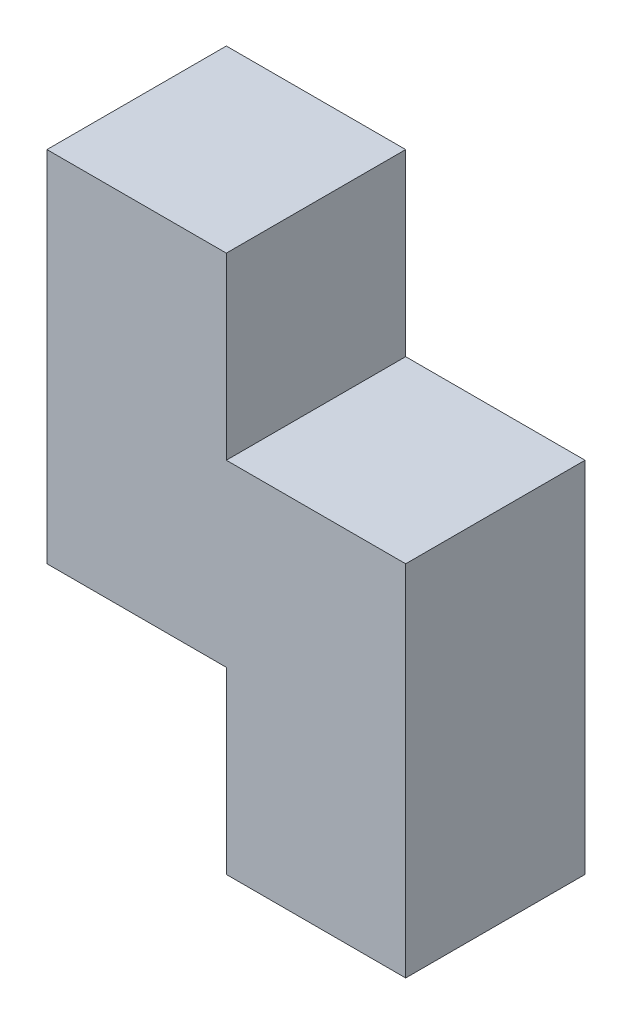
ISO-10303-21;
HEADER;
FILE_DESCRIPTION(('STEP AP214'),'2;1');
FILE_NAME('part.step','',(''),(''),'','','');
FILE_SCHEMA(('AUTOMOTIVE_DESIGN { 1 0 10303 214 1 1 1 1 }'));
ENDSEC;
DATA;
#1=APPLICATION_CONTEXT('core data for automotive mechanical design processes');
#2=APPLICATION_PROTOCOL_DEFINITION('international standard','automotive_design',2000,#1);
#3=PRODUCT_CONTEXT('',#1,'mechanical');
#4=PRODUCT('Part','Part','',(#3));
#5=PRODUCT_RELATED_PRODUCT_CATEGORY('part','',(#4));
#6=PRODUCT_DEFINITION_FORMATION('','',#4);
#7=PRODUCT_DEFINITION_CONTEXT('part definition',#1,'design');
#8=PRODUCT_DEFINITION('design','',#6,#7);
#9=PRODUCT_DEFINITION_SHAPE('','',#8);
#10=(LENGTH_UNIT() NAMED_UNIT(*) SI_UNIT(.MILLI.,.METRE.));
#11=(NAMED_UNIT(*) PLANE_ANGLE_UNIT() SI_UNIT($,.RADIAN.));
#12=(NAMED_UNIT(*) SI_UNIT($,.STERADIAN.) SOLID_ANGLE_UNIT());
#13=UNCERTAINTY_MEASURE_WITH_UNIT(LENGTH_MEASURE(1.E-05),#10,'distance_accuracy_value','');
#14=(GEOMETRIC_REPRESENTATION_CONTEXT(3) GLOBAL_UNCERTAINTY_ASSIGNED_CONTEXT((#13)) GLOBAL_UNIT_ASSIGNED_CONTEXT((#10,
#11,#12)) REPRESENTATION_CONTEXT('',''));
#15=CARTESIAN_POINT('',(0.,0.,0.));
#16=DIRECTION('',(0.,0.,1.));
#17=DIRECTION('',(1.,0.,0.));
#18=AXIS2_PLACEMENT_3D('',#15,#16,#17);
#19=CARTESIAN_POINT('',(30.,45.,15.));
#20=DIRECTION('',(0.,-1.,0.));
#21=DIRECTION('',(0.,0.,-1.));
#22=AXIS2_PLACEMENT_3D('',#19,#20,#21);
#23=PLANE('',#22);
#24=DIRECTION('',(-1.,0.,0.));
#25=VECTOR('',#24,1.);
#26=CARTESIAN_POINT('',(30.,45.,15.));
#27=LINE('',#26,#25);
#28=CARTESIAN_POINT('',(0.,45.,15.));
#29=VERTEX_POINT('',#28);
#30=CARTESIAN_POINT('',(-30.,45.,15.));
#31=VERTEX_POINT('',#30);
#32=EDGE_CURVE('E132',#29,#31,#27,.T.);
#33=ORIENTED_EDGE('',*,*,#32,.F.);
#34=DIRECTION('',(0.,0.,1.));
#35=VECTOR('',#34,1.);
#36=CARTESIAN_POINT('',(0.,45.,-15.));
#37=LINE('',#36,#35);
#38=CARTESIAN_POINT('',(0.,45.,-15.));
#39=VERTEX_POINT('',#38);
#40=EDGE_CURVE('E174',#39,#29,#37,.T.);
#41=ORIENTED_EDGE('',*,*,#40,.F.);
#42=DIRECTION('',(-1.,0.,0.));
#43=VECTOR('',#42,1.);
#44=CARTESIAN_POINT('',(30.,45.,-15.));
#45=LINE('',#44,#43);
#46=CARTESIAN_POINT('',(-30.,45.,-15.));
#47=VERTEX_POINT('',#46);
#48=EDGE_CURVE('E135',#39,#47,#45,.T.);
#49=ORIENTED_EDGE('',*,*,#48,.T.);
#50=DIRECTION('',(0.,0.,-1.));
#51=VECTOR('',#50,1.);
#52=CARTESIAN_POINT('',(-30.,45.,15.));
#53=LINE('',#52,#51);
#54=EDGE_CURVE('E11',#31,#47,#53,.T.);
#55=ORIENTED_EDGE('',*,*,#54,.F.);
#56=EDGE_LOOP('',(#33,#41,#49,#55));
#57=FACE_BOUND('',#56,.T.);
#58=ADVANCED_FACE('F43',(#57),#23,.F.);
#59=CARTESIAN_POINT('',(-30.,-45.,15.));
#60=DIRECTION('',(1.,0.,0.));
#61=DIRECTION('',(0.,0.,-1.));
#62=AXIS2_PLACEMENT_3D('',#59,#60,#61);
#63=PLANE('',#62);
#64=DIRECTION('',(0.,-1.,0.));
#65=VECTOR('',#64,1.);
#66=CARTESIAN_POINT('',(-30.,-45.,-15.));
#67=LINE('',#66,#65);
#68=CARTESIAN_POINT('',(-30.,-15.,-15.));
#69=VERTEX_POINT('',#68);
#70=EDGE_CURVE('E130',#47,#69,#67,.T.);
#71=ORIENTED_EDGE('',*,*,#70,.T.);
#72=DIRECTION('',(0.,0.,1.));
#73=VECTOR('',#72,1.);
#74=CARTESIAN_POINT('',(-30.,-15.,-15.));
#75=LINE('',#74,#73);
#76=CARTESIAN_POINT('',(-30.,-15.,15.));
#77=VERTEX_POINT('',#76);
#78=EDGE_CURVE('E148',#69,#77,#75,.T.);
#79=ORIENTED_EDGE('',*,*,#78,.T.);
#80=DIRECTION('',(0.,-1.,0.));
#81=VECTOR('',#80,1.);
#82=CARTESIAN_POINT('',(-30.,-45.,15.));
#83=LINE('',#82,#81);
#84=EDGE_CURVE('E145',#31,#77,#83,.T.);
#85=ORIENTED_EDGE('',*,*,#84,.F.);
#86=ORIENTED_EDGE('',*,*,#54,.T.);
#87=EDGE_LOOP('',(#71,#79,#85,#86));
#88=FACE_BOUND('',#87,.T.);
#89=ADVANCED_FACE('F183',(#88),#63,.F.);
#90=CARTESIAN_POINT('',(30.,-45.,15.));
#91=DIRECTION('',(0.,1.,0.));
#92=DIRECTION('',(0.,0.,1.));
#93=AXIS2_PLACEMENT_3D('',#90,#91,#92);
#94=PLANE('',#93);
#95=DIRECTION('',(1.,0.,0.));
#96=VECTOR('',#95,1.);
#97=CARTESIAN_POINT('',(30.,-45.,15.));
#98=LINE('',#97,#96);
#99=CARTESIAN_POINT('',(0.,-45.,15.));
#100=VERTEX_POINT('',#99);
#101=CARTESIAN_POINT('',(30.,-45.,15.));
#102=VERTEX_POINT('',#101);
#103=EDGE_CURVE('E124',#100,#102,#98,.T.);
#104=ORIENTED_EDGE('',*,*,#103,.F.);
#105=DIRECTION('',(0.,0.,1.));
#106=VECTOR('',#105,1.);
#107=CARTESIAN_POINT('',(0.,-45.,-15.));
#108=LINE('',#107,#106);
#109=CARTESIAN_POINT('',(0.,-45.,-15.));
#110=VERTEX_POINT('',#109);
#111=EDGE_CURVE('E111',#110,#100,#108,.T.);
#112=ORIENTED_EDGE('',*,*,#111,.F.);
#113=DIRECTION('',(1.,0.,0.));
#114=VECTOR('',#113,1.);
#115=CARTESIAN_POINT('',(30.,-45.,-15.));
#116=LINE('',#115,#114);
#117=CARTESIAN_POINT('',(30.,-45.,-15.));
#118=VERTEX_POINT('',#117);
#119=EDGE_CURVE('E122',#110,#118,#116,.T.);
#120=ORIENTED_EDGE('',*,*,#119,.T.);
#121=DIRECTION('',(0.,0.,-1.));
#122=VECTOR('',#121,1.);
#123=CARTESIAN_POINT('',(30.,-45.,15.));
#124=LINE('',#123,#122);
#125=EDGE_CURVE('E50',#102,#118,#124,.T.);
#126=ORIENTED_EDGE('',*,*,#125,.F.);
#127=EDGE_LOOP('',(#104,#112,#120,#126));
#128=FACE_BOUND('',#127,.T.);
#129=ADVANCED_FACE('F120',(#128),#94,.F.);
#130=CARTESIAN_POINT('',(30.,-45.,15.));
#131=DIRECTION('',(-1.,0.,0.));
#132=DIRECTION('',(0.,0.,1.));
#133=AXIS2_PLACEMENT_3D('',#130,#131,#132);
#134=PLANE('',#133);
#135=DIRECTION('',(0.,1.,0.));
#136=VECTOR('',#135,1.);
#137=CARTESIAN_POINT('',(30.,-45.,-15.));
#138=LINE('',#137,#136);
#139=CARTESIAN_POINT('',(30.,15.,-15.));
#140=VERTEX_POINT('',#139);
#141=EDGE_CURVE('E129',#118,#140,#138,.T.);
#142=ORIENTED_EDGE('',*,*,#141,.T.);
#143=DIRECTION('',(0.,0.,1.));
#144=VECTOR('',#143,1.);
#145=CARTESIAN_POINT('',(30.,15.,-15.));
#146=LINE('',#145,#144);
#147=CARTESIAN_POINT('',(30.,15.,15.));
#148=VERTEX_POINT('',#147);
#149=EDGE_CURVE('E65',#140,#148,#146,.T.);
#150=ORIENTED_EDGE('',*,*,#149,.T.);
#151=DIRECTION('',(0.,1.,0.));
#152=VECTOR('',#151,1.);
#153=CARTESIAN_POINT('',(30.,-45.,15.));
#154=LINE('',#153,#152);
#155=EDGE_CURVE('E138',#102,#148,#154,.T.);
#156=ORIENTED_EDGE('',*,*,#155,.F.);
#157=ORIENTED_EDGE('',*,*,#125,.T.);
#158=EDGE_LOOP('',(#142,#150,#156,#157));
#159=FACE_BOUND('',#158,.T.);
#160=ADVANCED_FACE('F204',(#159),#134,.F.);
#161=CARTESIAN_POINT('',(0.,0.,15.));
#162=DIRECTION('',(0.,0.,-1.));
#163=DIRECTION('',(-1.,0.,0.));
#164=AXIS2_PLACEMENT_3D('',#161,#162,#163);
#165=PLANE('',#164);
#166=ORIENTED_EDGE('',*,*,#84,.T.);
#167=DIRECTION('',(-1.,0.,0.));
#168=VECTOR('',#167,1.);
#169=CARTESIAN_POINT('',(0.,-15.,15.));
#170=LINE('',#169,#168);
#171=CARTESIAN_POINT('',(0.,-15.,15.));
#172=VERTEX_POINT('',#171);
#173=EDGE_CURVE('E116',#172,#77,#170,.T.);
#174=ORIENTED_EDGE('',*,*,#173,.F.);
#175=DIRECTION('',(0.,1.,0.));
#176=VECTOR('',#175,1.);
#177=CARTESIAN_POINT('',(0.,0.,15.));
#178=LINE('',#177,#176);
#179=EDGE_CURVE('E176',#100,#172,#178,.T.);
#180=ORIENTED_EDGE('',*,*,#179,.F.);
#181=ORIENTED_EDGE('',*,*,#103,.T.);
#182=ORIENTED_EDGE('',*,*,#155,.T.);
#183=DIRECTION('',(1.,0.,0.));
#184=VECTOR('',#183,1.);
#185=CARTESIAN_POINT('',(0.,15.,15.));
#186=LINE('',#185,#184);
#187=CARTESIAN_POINT('',(0.,15.,15.));
#188=VERTEX_POINT('',#187);
#189=EDGE_CURVE('E167',#188,#148,#186,.T.);
#190=ORIENTED_EDGE('',*,*,#189,.F.);
#191=DIRECTION('',(0.,-1.,0.));
#192=VECTOR('',#191,1.);
#193=CARTESIAN_POINT('',(0.,0.,15.));
#194=LINE('',#193,#192);
#195=EDGE_CURVE('E170',#29,#188,#194,.T.);
#196=ORIENTED_EDGE('',*,*,#195,.F.);
#197=ORIENTED_EDGE('',*,*,#32,.T.);
#198=EDGE_LOOP('',(#166,#174,#180,#181,#182,#190,#196,#197));
#199=FACE_BOUND('',#198,.T.);
#200=ADVANCED_FACE('F180',(#199),#165,.F.);
#201=CARTESIAN_POINT('',(0.,0.,-15.));
#202=DIRECTION('',(0.,0.,-1.));
#203=DIRECTION('',(-1.,0.,0.));
#204=AXIS2_PLACEMENT_3D('',#201,#202,#203);
#205=PLANE('',#204);
#206=DIRECTION('',(-1.,0.,0.));
#207=VECTOR('',#206,1.);
#208=CARTESIAN_POINT('',(0.,-15.,-15.));
#209=LINE('',#208,#207);
#210=CARTESIAN_POINT('',(0.,-15.,-15.));
#211=VERTEX_POINT('',#210);
#212=EDGE_CURVE('E57',#211,#69,#209,.T.);
#213=ORIENTED_EDGE('',*,*,#212,.T.);
#214=ORIENTED_EDGE('',*,*,#70,.F.);
#215=ORIENTED_EDGE('',*,*,#48,.F.);
#216=DIRECTION('',(0.,-1.,0.));
#217=VECTOR('',#216,1.);
#218=CARTESIAN_POINT('',(0.,0.,-15.));
#219=LINE('',#218,#217);
#220=CARTESIAN_POINT('',(0.,15.,-15.));
#221=VERTEX_POINT('',#220);
#222=EDGE_CURVE('E163',#39,#221,#219,.T.);
#223=ORIENTED_EDGE('',*,*,#222,.T.);
#224=DIRECTION('',(1.,0.,0.));
#225=VECTOR('',#224,1.);
#226=CARTESIAN_POINT('',(0.,15.,-15.));
#227=LINE('',#226,#225);
#228=EDGE_CURVE('E166',#221,#140,#227,.T.);
#229=ORIENTED_EDGE('',*,*,#228,.T.);
#230=ORIENTED_EDGE('',*,*,#141,.F.);
#231=ORIENTED_EDGE('',*,*,#119,.F.);
#232=DIRECTION('',(0.,1.,0.));
#233=VECTOR('',#232,1.);
#234=CARTESIAN_POINT('',(0.,0.,-15.));
#235=LINE('',#234,#233);
#236=EDGE_CURVE('E107',#110,#211,#235,.T.);
#237=ORIENTED_EDGE('',*,*,#236,.T.);
#238=EDGE_LOOP('',(#213,#214,#215,#223,#229,#230,#231,#237));
#239=FACE_BOUND('',#238,.T.);
#240=ADVANCED_FACE('F127',(#239),#205,.T.);
#241=CARTESIAN_POINT('',(0.,0.,-15.));
#242=DIRECTION('',(-1.,0.,0.));
#243=DIRECTION('',(0.,-1.,0.));
#244=AXIS2_PLACEMENT_3D('',#241,#242,#243);
#245=PLANE('',#244);
#246=ORIENTED_EDGE('',*,*,#195,.T.);
#247=DIRECTION('',(0.,0.,1.));
#248=VECTOR('',#247,1.);
#249=CARTESIAN_POINT('',(0.,15.,-15.));
#250=LINE('',#249,#248);
#251=EDGE_CURVE('E169',#221,#188,#250,.T.);
#252=ORIENTED_EDGE('',*,*,#251,.F.);
#253=ORIENTED_EDGE('',*,*,#222,.F.);
#254=ORIENTED_EDGE('',*,*,#40,.T.);
#255=EDGE_LOOP('',(#246,#252,#253,#254));
#256=FACE_BOUND('',#255,.T.);
#257=ADVANCED_FACE('F195',(#256),#245,.F.);
#258=CARTESIAN_POINT('',(0.,15.,-15.));
#259=DIRECTION('',(0.,-1.,0.));
#260=DIRECTION('',(0.,0.,-1.));
#261=AXIS2_PLACEMENT_3D('',#258,#259,#260);
#262=PLANE('',#261);
#263=ORIENTED_EDGE('',*,*,#189,.T.);
#264=ORIENTED_EDGE('',*,*,#149,.F.);
#265=ORIENTED_EDGE('',*,*,#228,.F.);
#266=ORIENTED_EDGE('',*,*,#251,.T.);
#267=EDGE_LOOP('',(#263,#264,#265,#266));
#268=FACE_BOUND('',#267,.T.);
#269=ADVANCED_FACE('F188',(#268),#262,.F.);
#270=CARTESIAN_POINT('',(0.,-15.,-15.));
#271=DIRECTION('',(0.,1.,0.));
#272=DIRECTION('',(-1.,0.,0.));
#273=AXIS2_PLACEMENT_3D('',#270,#271,#272);
#274=PLANE('',#273);
#275=ORIENTED_EDGE('',*,*,#173,.T.);
#276=ORIENTED_EDGE('',*,*,#78,.F.);
#277=ORIENTED_EDGE('',*,*,#212,.F.);
#278=DIRECTION('',(0.,0.,1.));
#279=VECTOR('',#278,1.);
#280=CARTESIAN_POINT('',(0.,-15.,-15.));
#281=LINE('',#280,#279);
#282=EDGE_CURVE('E113',#211,#172,#281,.T.);
#283=ORIENTED_EDGE('',*,*,#282,.T.);
#284=EDGE_LOOP('',(#275,#276,#277,#283));
#285=FACE_BOUND('',#284,.T.);
#286=ADVANCED_FACE('F186',(#285),#274,.F.);
#287=CARTESIAN_POINT('',(0.,0.,-15.));
#288=DIRECTION('',(1.,0.,0.));
#289=DIRECTION('',(0.,1.,0.));
#290=AXIS2_PLACEMENT_3D('',#287,#288,#289);
#291=PLANE('',#290);
#292=ORIENTED_EDGE('',*,*,#179,.T.);
#293=ORIENTED_EDGE('',*,*,#282,.F.);
#294=ORIENTED_EDGE('',*,*,#236,.F.);
#295=ORIENTED_EDGE('',*,*,#111,.T.);
#296=EDGE_LOOP('',(#292,#293,#294,#295));
#297=FACE_BOUND('',#296,.T.);
#298=ADVANCED_FACE('F110',(#297),#291,.F.);
#299=CLOSED_SHELL('',(#58,#89,#129,#160,#200,#240,#257,#269,#286,#298));
#300=MANIFOLD_SOLID_BREP('B2',#299);
#301=ADVANCED_BREP_SHAPE_REPRESENTATION('',(#18,#300),#14);
#302=SHAPE_DEFINITION_REPRESENTATION(#9,#301);
ENDSEC;
END-ISO-10303-21;
